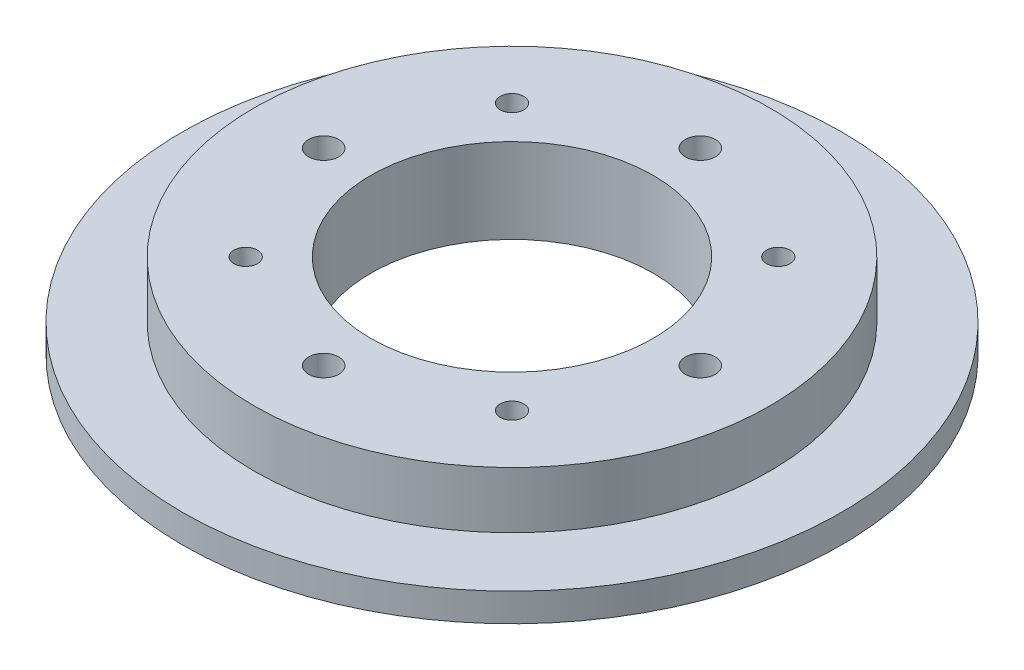
ISO-10303-21;
HEADER;
FILE_DESCRIPTION(('STEP AP214'),'2;1');
FILE_NAME('part.step','',(''),(''),'','','');
FILE_SCHEMA(('AUTOMOTIVE_DESIGN { 1 0 10303 214 1 1 1 1 }'));
ENDSEC;
DATA;
#1=APPLICATION_CONTEXT('core data for automotive mechanical design processes');
#2=APPLICATION_PROTOCOL_DEFINITION('international standard','automotive_design',2000,#1);
#3=PRODUCT_CONTEXT('',#1,'mechanical');
#4=PRODUCT('Part','Part','',(#3));
#5=PRODUCT_RELATED_PRODUCT_CATEGORY('part','',(#4));
#6=PRODUCT_DEFINITION_FORMATION('','',#4);
#7=PRODUCT_DEFINITION_CONTEXT('part definition',#1,'design');
#8=PRODUCT_DEFINITION('design','',#6,#7);
#9=PRODUCT_DEFINITION_SHAPE('','',#8);
#10=(LENGTH_UNIT() NAMED_UNIT(*) SI_UNIT(.MILLI.,.METRE.));
#11=(NAMED_UNIT(*) PLANE_ANGLE_UNIT() SI_UNIT($,.RADIAN.));
#12=(NAMED_UNIT(*) SI_UNIT($,.STERADIAN.) SOLID_ANGLE_UNIT());
#13=UNCERTAINTY_MEASURE_WITH_UNIT(LENGTH_MEASURE(1.E-05),#10,'distance_accuracy_value','');
#14=(GEOMETRIC_REPRESENTATION_CONTEXT(3) GLOBAL_UNCERTAINTY_ASSIGNED_CONTEXT((#13)) GLOBAL_UNIT_ASSIGNED_CONTEXT((#10,
#11,#12)) REPRESENTATION_CONTEXT('',''));
#15=CARTESIAN_POINT('',(0.,0.,0.));
#16=DIRECTION('',(0.,0.,1.));
#17=DIRECTION('',(1.,0.,0.));
#18=AXIS2_PLACEMENT_3D('',#15,#16,#17);
#19=CARTESIAN_POINT('',(0.,3.,0.));
#20=DIRECTION('',(0.,-1.,0.));
#21=DIRECTION('',(0.,0.,-1.));
#22=AXIS2_PLACEMENT_3D('',#19,#20,#21);
#23=CYLINDRICAL_SURFACE('',#22,35.);
#24=CARTESIAN_POINT('',(0.,3.,0.));
#25=DIRECTION('',(0.,1.,0.));
#26=DIRECTION('',(0.,0.,1.));
#27=AXIS2_PLACEMENT_3D('',#24,#25,#26);
#28=CIRCLE('',#27,35.);
#29=CARTESIAN_POINT('',(0.,3.,35.));
#30=VERTEX_POINT('',#29);
#31=EDGE_CURVE('E38',#30,#30,#28,.T.);
#32=ORIENTED_EDGE('',*,*,#31,.F.);
#33=EDGE_LOOP('',(#32));
#34=FACE_BOUND('',#33,.T.);
#35=CARTESIAN_POINT('',(0.,0.,0.));
#36=DIRECTION('',(0.,1.,0.));
#37=DIRECTION('',(0.,0.,1.));
#38=AXIS2_PLACEMENT_3D('',#35,#36,#37);
#39=CIRCLE('',#38,35.);
#40=CARTESIAN_POINT('',(0.,0.,35.));
#41=VERTEX_POINT('',#40);
#42=EDGE_CURVE('E34',#41,#41,#39,.T.);
#43=ORIENTED_EDGE('',*,*,#42,.T.);
#44=EDGE_LOOP('',(#43));
#45=FACE_BOUND('',#44,.T.);
#46=ADVANCED_FACE('F31',(#34,#45),#23,.T.);
#47=CARTESIAN_POINT('',(0.,3.,0.));
#48=DIRECTION('',(0.,1.,0.));
#49=DIRECTION('',(0.,0.,1.));
#50=AXIS2_PLACEMENT_3D('',#47,#48,#49);
#51=PLANE('',#50);
#52=CARTESIAN_POINT('',(0.,3.,0.));
#53=DIRECTION('',(0.,1.,0.));
#54=DIRECTION('',(0.,0.,1.));
#55=AXIS2_PLACEMENT_3D('',#52,#53,#54);
#56=CIRCLE('',#55,27.4);
#57=CARTESIAN_POINT('',(0.,3.,27.4));
#58=VERTEX_POINT('',#57);
#59=EDGE_CURVE('E10',#58,#58,#56,.T.);
#60=ORIENTED_EDGE('',*,*,#59,.F.);
#61=EDGE_LOOP('',(#60));
#62=FACE_BOUND('',#61,.T.);
#63=ORIENTED_EDGE('',*,*,#31,.T.);
#64=EDGE_LOOP('',(#63));
#65=FACE_BOUND('',#64,.T.);
#66=ADVANCED_FACE('F117',(#62,#65),#51,.T.);
#67=CARTESIAN_POINT('',(0.,0.,0.));
#68=DIRECTION('',(0.,1.,0.));
#69=DIRECTION('',(0.,0.,1.));
#70=AXIS2_PLACEMENT_3D('',#67,#68,#69);
#71=PLANE('',#70);
#72=CARTESIAN_POINT('',(-14.1421356237309,0.,-14.142135623731));
#73=DIRECTION('',(0.,-1.,0.));
#74=DIRECTION('',(0.,0.,-1.));
#75=AXIS2_PLACEMENT_3D('',#72,#73,#74);
#76=CIRCLE('',#75,1.2500000000002);
#77=CARTESIAN_POINT('',(-14.1421356237309,0.,-15.3921356237312));
#78=VERTEX_POINT('',#77);
#79=EDGE_CURVE('E84',#78,#78,#76,.T.);
#80=ORIENTED_EDGE('',*,*,#79,.F.);
#81=EDGE_LOOP('',(#80));
#82=FACE_BOUND('',#81,.T.);
#83=CARTESIAN_POINT('',(14.142135623731,0.,-14.1421356237309));
#84=DIRECTION('',(0.,-1.,0.));
#85=DIRECTION('',(0.,0.,-1.));
#86=AXIS2_PLACEMENT_3D('',#83,#84,#85);
#87=CIRCLE('',#86,1.25000000000014);
#88=CARTESIAN_POINT('',(14.142135623731,0.,-15.392135623731));
#89=VERTEX_POINT('',#88);
#90=EDGE_CURVE('E90',#89,#89,#87,.T.);
#91=ORIENTED_EDGE('',*,*,#90,.F.);
#92=EDGE_LOOP('',(#91));
#93=FACE_BOUND('',#92,.T.);
#94=CARTESIAN_POINT('',(14.1421356237309,0.,14.142135623731));
#95=DIRECTION('',(0.,-1.,0.));
#96=DIRECTION('',(0.,0.,-1.));
#97=AXIS2_PLACEMENT_3D('',#94,#95,#96);
#98=CIRCLE('',#97,1.25000000000006);
#99=CARTESIAN_POINT('',(14.1421356237309,0.,12.892135623731));
#100=VERTEX_POINT('',#99);
#101=EDGE_CURVE('E96',#100,#100,#98,.T.);
#102=ORIENTED_EDGE('',*,*,#101,.F.);
#103=EDGE_LOOP('',(#102));
#104=FACE_BOUND('',#103,.T.);
#105=CARTESIAN_POINT('',(-14.142135623731,0.,14.1421356237309));
#106=DIRECTION('',(0.,-1.,0.));
#107=DIRECTION('',(0.,0.,-1.));
#108=AXIS2_PLACEMENT_3D('',#105,#106,#107);
#109=CIRCLE('',#108,1.25);
#110=CARTESIAN_POINT('',(-14.142135623731,0.,12.8921356237309));
#111=VERTEX_POINT('',#110);
#112=EDGE_CURVE('E78',#111,#111,#109,.T.);
#113=ORIENTED_EDGE('',*,*,#112,.F.);
#114=EDGE_LOOP('',(#113));
#115=FACE_BOUND('',#114,.T.);
#116=CARTESIAN_POINT('',(0.,0.,0.));
#117=DIRECTION('',(0.,1.,0.));
#118=DIRECTION('',(0.,0.,1.));
#119=AXIS2_PLACEMENT_3D('',#116,#117,#118);
#120=CIRCLE('',#119,15.);
#121=CARTESIAN_POINT('',(0.,0.,15.));
#122=VERTEX_POINT('',#121);
#123=EDGE_CURVE('E52',#122,#122,#120,.T.);
#124=ORIENTED_EDGE('',*,*,#123,.T.);
#125=EDGE_LOOP('',(#124));
#126=FACE_BOUND('',#125,.T.);
#127=CARTESIAN_POINT('',(0.,0.,-20.));
#128=DIRECTION('',(0.,1.,0.));
#129=DIRECTION('',(0.,0.,1.));
#130=AXIS2_PLACEMENT_3D('',#127,#128,#129);
#131=CIRCLE('',#130,1.6);
#132=CARTESIAN_POINT('',(0.,0.,-18.4));
#133=VERTEX_POINT('',#132);
#134=EDGE_CURVE('E47',#133,#133,#131,.T.);
#135=ORIENTED_EDGE('',*,*,#134,.T.);
#136=EDGE_LOOP('',(#135));
#137=FACE_BOUND('',#136,.T.);
#138=CARTESIAN_POINT('',(20.,0.,0.));
#139=DIRECTION('',(0.,1.,0.));
#140=DIRECTION('',(0.,0.,1.));
#141=AXIS2_PLACEMENT_3D('',#138,#139,#140);
#142=CIRCLE('',#141,1.6);
#143=CARTESIAN_POINT('',(20.,0.,1.6));
#144=VERTEX_POINT('',#143);
#145=EDGE_CURVE('E64',#144,#144,#142,.T.);
#146=ORIENTED_EDGE('',*,*,#145,.T.);
#147=EDGE_LOOP('',(#146));
#148=FACE_BOUND('',#147,.T.);
#149=CARTESIAN_POINT('',(0.,0.,20.));
#150=DIRECTION('',(0.,1.,0.));
#151=DIRECTION('',(0.,0.,1.));
#152=AXIS2_PLACEMENT_3D('',#149,#150,#151);
#153=CIRCLE('',#152,1.6);
#154=CARTESIAN_POINT('',(0.,0.,21.6));
#155=VERTEX_POINT('',#154);
#156=EDGE_CURVE('E58',#155,#155,#153,.T.);
#157=ORIENTED_EDGE('',*,*,#156,.T.);
#158=EDGE_LOOP('',(#157));
#159=FACE_BOUND('',#158,.T.);
#160=CARTESIAN_POINT('',(-20.,0.,0.));
#161=DIRECTION('',(0.,1.,0.));
#162=DIRECTION('',(0.,0.,1.));
#163=AXIS2_PLACEMENT_3D('',#160,#161,#162);
#164=CIRCLE('',#163,1.6);
#165=CARTESIAN_POINT('',(-20.,0.,1.6));
#166=VERTEX_POINT('',#165);
#167=EDGE_CURVE('E51',#166,#166,#164,.T.);
#168=ORIENTED_EDGE('',*,*,#167,.T.);
#169=EDGE_LOOP('',(#168));
#170=FACE_BOUND('',#169,.T.);
#171=ORIENTED_EDGE('',*,*,#42,.F.);
#172=EDGE_LOOP('',(#171));
#173=FACE_BOUND('',#172,.T.);
#174=ADVANCED_FACE('F113',(#82,#93,#104,#115,#126,#137,#148,#159,#170,#173),#71,.F.);
#175=CARTESIAN_POINT('',(0.,9.,0.));
#176=DIRECTION('',(0.,-1.,0.));
#177=DIRECTION('',(0.,0.,-1.));
#178=AXIS2_PLACEMENT_3D('',#175,#176,#177);
#179=CYLINDRICAL_SURFACE('',#178,27.4);
#180=CARTESIAN_POINT('',(0.,9.,0.));
#181=DIRECTION('',(0.,1.,0.));
#182=DIRECTION('',(0.,0.,1.));
#183=AXIS2_PLACEMENT_3D('',#180,#181,#182);
#184=CIRCLE('',#183,27.4);
#185=CARTESIAN_POINT('',(0.,9.,27.4));
#186=VERTEX_POINT('',#185);
#187=EDGE_CURVE('E44',#186,#186,#184,.T.);
#188=ORIENTED_EDGE('',*,*,#187,.F.);
#189=EDGE_LOOP('',(#188));
#190=FACE_BOUND('',#189,.T.);
#191=ORIENTED_EDGE('',*,*,#59,.T.);
#192=EDGE_LOOP('',(#191));
#193=FACE_BOUND('',#192,.T.);
#194=ADVANCED_FACE('F116',(#190,#193),#179,.T.);
#195=CARTESIAN_POINT('',(0.,9.,0.));
#196=DIRECTION('',(0.,1.,0.));
#197=DIRECTION('',(0.,0.,1.));
#198=AXIS2_PLACEMENT_3D('',#195,#196,#197);
#199=PLANE('',#198);
#200=CARTESIAN_POINT('',(-14.1421356237309,9.,-14.142135623731));
#201=DIRECTION('',(0.,-1.,0.));
#202=DIRECTION('',(0.,0.,-1.));
#203=AXIS2_PLACEMENT_3D('',#200,#201,#202);
#204=CIRCLE('',#203,1.2500000000002);
#205=CARTESIAN_POINT('',(-14.1421356237309,9.,-15.3921356237312));
#206=VERTEX_POINT('',#205);
#207=EDGE_CURVE('E87',#206,#206,#204,.T.);
#208=ORIENTED_EDGE('',*,*,#207,.T.);
#209=EDGE_LOOP('',(#208));
#210=FACE_BOUND('',#209,.T.);
#211=CARTESIAN_POINT('',(14.142135623731,9.,-14.1421356237309));
#212=DIRECTION('',(0.,-1.,0.));
#213=DIRECTION('',(0.,0.,-1.));
#214=AXIS2_PLACEMENT_3D('',#211,#212,#213);
#215=CIRCLE('',#214,1.25000000000014);
#216=CARTESIAN_POINT('',(14.142135623731,9.,-15.392135623731));
#217=VERTEX_POINT('',#216);
#218=EDGE_CURVE('E93',#217,#217,#215,.T.);
#219=ORIENTED_EDGE('',*,*,#218,.T.);
#220=EDGE_LOOP('',(#219));
#221=FACE_BOUND('',#220,.T.);
#222=CARTESIAN_POINT('',(14.1421356237309,9.,14.142135623731));
#223=DIRECTION('',(0.,-1.,0.));
#224=DIRECTION('',(0.,0.,-1.));
#225=AXIS2_PLACEMENT_3D('',#222,#223,#224);
#226=CIRCLE('',#225,1.25000000000006);
#227=CARTESIAN_POINT('',(14.1421356237309,9.,12.892135623731));
#228=VERTEX_POINT('',#227);
#229=EDGE_CURVE('E81',#228,#228,#226,.T.);
#230=ORIENTED_EDGE('',*,*,#229,.T.);
#231=EDGE_LOOP('',(#230));
#232=FACE_BOUND('',#231,.T.);
#233=CARTESIAN_POINT('',(-14.142135623731,9.,14.1421356237309));
#234=DIRECTION('',(0.,-1.,0.));
#235=DIRECTION('',(0.,0.,-1.));
#236=AXIS2_PLACEMENT_3D('',#233,#234,#235);
#237=CIRCLE('',#236,1.25);
#238=CARTESIAN_POINT('',(-14.142135623731,9.,12.8921356237309));
#239=VERTEX_POINT('',#238);
#240=EDGE_CURVE('E75',#239,#239,#237,.T.);
#241=ORIENTED_EDGE('',*,*,#240,.T.);
#242=EDGE_LOOP('',(#241));
#243=FACE_BOUND('',#242,.T.);
#244=CARTESIAN_POINT('',(0.,9.,0.));
#245=DIRECTION('',(0.,1.,0.));
#246=DIRECTION('',(0.,0.,1.));
#247=AXIS2_PLACEMENT_3D('',#244,#245,#246);
#248=CIRCLE('',#247,15.);
#249=CARTESIAN_POINT('',(0.,9.,15.));
#250=VERTEX_POINT('',#249);
#251=EDGE_CURVE('E72',#250,#250,#248,.T.);
#252=ORIENTED_EDGE('',*,*,#251,.F.);
#253=EDGE_LOOP('',(#252));
#254=FACE_BOUND('',#253,.T.);
#255=CARTESIAN_POINT('',(0.,9.,-20.));
#256=DIRECTION('',(0.,1.,0.));
#257=DIRECTION('',(0.,0.,1.));
#258=AXIS2_PLACEMENT_3D('',#255,#256,#257);
#259=CIRCLE('',#258,1.6);
#260=CARTESIAN_POINT('',(0.,9.,-18.4));
#261=VERTEX_POINT('',#260);
#262=EDGE_CURVE('E67',#261,#261,#259,.T.);
#263=ORIENTED_EDGE('',*,*,#262,.F.);
#264=EDGE_LOOP('',(#263));
#265=FACE_BOUND('',#264,.T.);
#266=CARTESIAN_POINT('',(20.,9.,0.));
#267=DIRECTION('',(0.,1.,0.));
#268=DIRECTION('',(0.,0.,1.));
#269=AXIS2_PLACEMENT_3D('',#266,#267,#268);
#270=CIRCLE('',#269,1.6);
#271=CARTESIAN_POINT('',(20.,9.,1.6));
#272=VERTEX_POINT('',#271);
#273=EDGE_CURVE('E61',#272,#272,#270,.T.);
#274=ORIENTED_EDGE('',*,*,#273,.F.);
#275=EDGE_LOOP('',(#274));
#276=FACE_BOUND('',#275,.T.);
#277=CARTESIAN_POINT('',(0.,9.,20.));
#278=DIRECTION('',(0.,1.,0.));
#279=DIRECTION('',(0.,0.,1.));
#280=AXIS2_PLACEMENT_3D('',#277,#278,#279);
#281=CIRCLE('',#280,1.6);
#282=CARTESIAN_POINT('',(0.,9.,21.6));
#283=VERTEX_POINT('',#282);
#284=EDGE_CURVE('E55',#283,#283,#281,.T.);
#285=ORIENTED_EDGE('',*,*,#284,.F.);
#286=EDGE_LOOP('',(#285));
#287=FACE_BOUND('',#286,.T.);
#288=CARTESIAN_POINT('',(-20.,9.,0.));
#289=DIRECTION('',(0.,1.,0.));
#290=DIRECTION('',(0.,0.,1.));
#291=AXIS2_PLACEMENT_3D('',#288,#289,#290);
#292=CIRCLE('',#291,1.6);
#293=CARTESIAN_POINT('',(-20.,9.,1.6));
#294=VERTEX_POINT('',#293);
#295=EDGE_CURVE('E48',#294,#294,#292,.T.);
#296=ORIENTED_EDGE('',*,*,#295,.F.);
#297=EDGE_LOOP('',(#296));
#298=FACE_BOUND('',#297,.T.);
#299=ORIENTED_EDGE('',*,*,#187,.T.);
#300=EDGE_LOOP('',(#299));
#301=FACE_BOUND('',#300,.T.);
#302=ADVANCED_FACE('F102',(#210,#221,#232,#243,#254,#265,#276,#287,#298,#301),#199,.T.);
#303=CARTESIAN_POINT('',(-20.,0.,0.));
#304=DIRECTION('',(0.,1.,0.));
#305=DIRECTION('',(0.,0.,1.));
#306=AXIS2_PLACEMENT_3D('',#303,#304,#305);
#307=CYLINDRICAL_SURFACE('',#306,1.6);
#308=ORIENTED_EDGE('',*,*,#167,.F.);
#309=EDGE_LOOP('',(#308));
#310=FACE_BOUND('',#309,.T.);
#311=ORIENTED_EDGE('',*,*,#295,.T.);
#312=EDGE_LOOP('',(#311));
#313=FACE_BOUND('',#312,.T.);
#314=ADVANCED_FACE('F152',(#310,#313),#307,.F.);
#315=CARTESIAN_POINT('',(0.,0.,20.));
#316=DIRECTION('',(0.,1.,0.));
#317=DIRECTION('',(0.,0.,1.));
#318=AXIS2_PLACEMENT_3D('',#315,#316,#317);
#319=CYLINDRICAL_SURFACE('',#318,1.6);
#320=ORIENTED_EDGE('',*,*,#156,.F.);
#321=EDGE_LOOP('',(#320));
#322=FACE_BOUND('',#321,.T.);
#323=ORIENTED_EDGE('',*,*,#284,.T.);
#324=EDGE_LOOP('',(#323));
#325=FACE_BOUND('',#324,.T.);
#326=ADVANCED_FACE('F156',(#322,#325),#319,.F.);
#327=CARTESIAN_POINT('',(20.,0.,0.));
#328=DIRECTION('',(0.,1.,0.));
#329=DIRECTION('',(0.,0.,1.));
#330=AXIS2_PLACEMENT_3D('',#327,#328,#329);
#331=CYLINDRICAL_SURFACE('',#330,1.6);
#332=ORIENTED_EDGE('',*,*,#145,.F.);
#333=EDGE_LOOP('',(#332));
#334=FACE_BOUND('',#333,.T.);
#335=ORIENTED_EDGE('',*,*,#273,.T.);
#336=EDGE_LOOP('',(#335));
#337=FACE_BOUND('',#336,.T.);
#338=ADVANCED_FACE('F160',(#334,#337),#331,.F.);
#339=CARTESIAN_POINT('',(0.,0.,-20.));
#340=DIRECTION('',(0.,1.,0.));
#341=DIRECTION('',(0.,0.,1.));
#342=AXIS2_PLACEMENT_3D('',#339,#340,#341);
#343=CYLINDRICAL_SURFACE('',#342,1.6);
#344=ORIENTED_EDGE('',*,*,#134,.F.);
#345=EDGE_LOOP('',(#344));
#346=FACE_BOUND('',#345,.T.);
#347=ORIENTED_EDGE('',*,*,#262,.T.);
#348=EDGE_LOOP('',(#347));
#349=FACE_BOUND('',#348,.T.);
#350=ADVANCED_FACE('F164',(#346,#349),#343,.F.);
#351=CARTESIAN_POINT('',(0.,0.,0.));
#352=DIRECTION('',(0.,1.,0.));
#353=DIRECTION('',(0.,0.,1.));
#354=AXIS2_PLACEMENT_3D('',#351,#352,#353);
#355=CYLINDRICAL_SURFACE('',#354,15.);
#356=ORIENTED_EDGE('',*,*,#123,.F.);
#357=EDGE_LOOP('',(#356));
#358=FACE_BOUND('',#357,.T.);
#359=ORIENTED_EDGE('',*,*,#251,.T.);
#360=EDGE_LOOP('',(#359));
#361=FACE_BOUND('',#360,.T.);
#362=ADVANCED_FACE('F168',(#358,#361),#355,.F.);
#363=CARTESIAN_POINT('',(-14.142135623731,9.,14.1421356237309));
#364=DIRECTION('',(0.,-1.,0.));
#365=DIRECTION('',(0.,0.,-1.));
#366=AXIS2_PLACEMENT_3D('',#363,#364,#365);
#367=CYLINDRICAL_SURFACE('',#366,1.25);
#368=ORIENTED_EDGE('',*,*,#240,.F.);
#369=EDGE_LOOP('',(#368));
#370=FACE_BOUND('',#369,.T.);
#371=ORIENTED_EDGE('',*,*,#112,.T.);
#372=EDGE_LOOP('',(#371));
#373=FACE_BOUND('',#372,.T.);
#374=ADVANCED_FACE('F109',(#370,#373),#367,.F.);
#375=CARTESIAN_POINT('',(14.1421356237309,9.,14.142135623731));
#376=DIRECTION('',(0.,-1.,0.));
#377=DIRECTION('',(0.,0.,-1.));
#378=AXIS2_PLACEMENT_3D('',#375,#376,#377);
#379=CYLINDRICAL_SURFACE('',#378,1.25000000000006);
#380=ORIENTED_EDGE('',*,*,#229,.F.);
#381=EDGE_LOOP('',(#380));
#382=FACE_BOUND('',#381,.T.);
#383=ORIENTED_EDGE('',*,*,#101,.T.);
#384=EDGE_LOOP('',(#383));
#385=FACE_BOUND('',#384,.T.);
#386=ADVANCED_FACE('F105',(#382,#385),#379,.F.);
#387=CARTESIAN_POINT('',(14.142135623731,9.,-14.1421356237309));
#388=DIRECTION('',(0.,-1.,0.));
#389=DIRECTION('',(0.,0.,-1.));
#390=AXIS2_PLACEMENT_3D('',#387,#388,#389);
#391=CYLINDRICAL_SURFACE('',#390,1.25000000000014);
#392=ORIENTED_EDGE('',*,*,#218,.F.);
#393=EDGE_LOOP('',(#392));
#394=FACE_BOUND('',#393,.T.);
#395=ORIENTED_EDGE('',*,*,#90,.T.);
#396=EDGE_LOOP('',(#395));
#397=FACE_BOUND('',#396,.T.);
#398=ADVANCED_FACE('F108',(#394,#397),#391,.F.);
#399=CARTESIAN_POINT('',(-14.1421356237309,9.,-14.142135623731));
#400=DIRECTION('',(0.,-1.,0.));
#401=DIRECTION('',(0.,0.,-1.));
#402=AXIS2_PLACEMENT_3D('',#399,#400,#401);
#403=CYLINDRICAL_SURFACE('',#402,1.2500000000002);
#404=ORIENTED_EDGE('',*,*,#207,.F.);
#405=EDGE_LOOP('',(#404));
#406=FACE_BOUND('',#405,.T.);
#407=ORIENTED_EDGE('',*,*,#79,.T.);
#408=EDGE_LOOP('',(#407));
#409=FACE_BOUND('',#408,.T.);
#410=ADVANCED_FACE('F176',(#406,#409),#403,.F.);
#411=CLOSED_SHELL('',(#46,#66,#174,#194,#302,#314,#326,#338,#350,#362,#374,#386,#398,#410));
#412=MANIFOLD_SOLID_BREP('B2',#411);
#413=ADVANCED_BREP_SHAPE_REPRESENTATION('',(#18,#412),#14);
#414=SHAPE_DEFINITION_REPRESENTATION(#9,#413);
ENDSEC;
END-ISO-10303-21;
